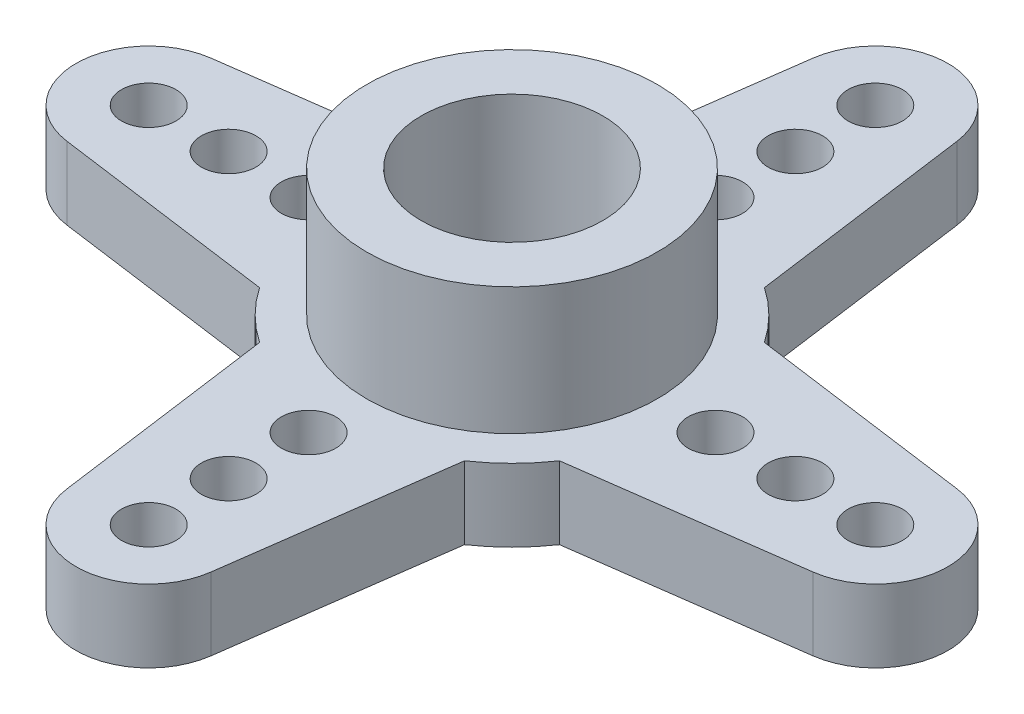
ISO-10303-21;
HEADER;
FILE_DESCRIPTION(('STEP AP214'),'2;1');
FILE_NAME('part.step','',(''),(''),'','','');
FILE_SCHEMA(('AUTOMOTIVE_DESIGN { 1 0 10303 214 1 1 1 1 }'));
ENDSEC;
DATA;
#1=APPLICATION_CONTEXT('core data for automotive mechanical design processes');
#2=APPLICATION_PROTOCOL_DEFINITION('international standard','automotive_design',2000,#1);
#3=PRODUCT_CONTEXT('',#1,'mechanical');
#4=PRODUCT('Part','Part','',(#3));
#5=PRODUCT_RELATED_PRODUCT_CATEGORY('part','',(#4));
#6=PRODUCT_DEFINITION_FORMATION('','',#4);
#7=PRODUCT_DEFINITION_CONTEXT('part definition',#1,'design');
#8=PRODUCT_DEFINITION('design','',#6,#7);
#9=PRODUCT_DEFINITION_SHAPE('','',#8);
#10=(LENGTH_UNIT() NAMED_UNIT(*) SI_UNIT(.MILLI.,.METRE.));
#11=(NAMED_UNIT(*) PLANE_ANGLE_UNIT() SI_UNIT($,.RADIAN.));
#12=(NAMED_UNIT(*) SI_UNIT($,.STERADIAN.) SOLID_ANGLE_UNIT());
#13=UNCERTAINTY_MEASURE_WITH_UNIT(LENGTH_MEASURE(1.E-05),#10,'distance_accuracy_value','');
#14=(GEOMETRIC_REPRESENTATION_CONTEXT(3) GLOBAL_UNCERTAINTY_ASSIGNED_CONTEXT((#13)) GLOBAL_UNIT_ASSIGNED_CONTEXT((#10,
#11,#12)) REPRESENTATION_CONTEXT('',''));
#15=CARTESIAN_POINT('',(0.,0.,0.));
#16=DIRECTION('',(0.,0.,1.));
#17=DIRECTION('',(1.,0.,0.));
#18=AXIS2_PLACEMENT_3D('',#15,#16,#17);
#19=CARTESIAN_POINT('',(-10.,0.,0.));
#20=DIRECTION('',(0.,1.,0.));
#21=DIRECTION('',(0.,0.,1.));
#22=AXIS2_PLACEMENT_3D('',#19,#20,#21);
#23=PLANE('',#22);
#24=DIRECTION('',(-0.990796233549053,0.,0.135361824695926));
#25=VECTOR('',#24,1.);
#26=CARTESIAN_POINT('',(-10.2707236493919,0.,-1.98159246709811));
#27=LINE('',#26,#25);
#28=CARTESIAN_POINT('',(-4.1283561060853,0.,-2.82075802956373));
#29=VERTEX_POINT('',#28);
#30=CARTESIAN_POINT('',(-10.2707236493919,0.,-1.98159246709811));
#31=VERTEX_POINT('',#30);
#32=EDGE_CURVE('E274',#29,#31,#27,.T.);
#33=ORIENTED_EDGE('',*,*,#32,.F.);
#34=CARTESIAN_POINT('',(0.,0.,0.));
#35=DIRECTION('',(0.,1.,0.));
#36=DIRECTION('',(0.,0.,1.));
#37=AXIS2_PLACEMENT_3D('',#34,#35,#36);
#38=CIRCLE('',#37,5.);
#39=CARTESIAN_POINT('',(-2.82075802956377,0.,-4.12835610608527));
#40=VERTEX_POINT('',#39);
#41=EDGE_CURVE('E316',#40,#29,#38,.T.);
#42=ORIENTED_EDGE('',*,*,#41,.F.);
#43=DIRECTION('',(-0.135361824695916,0.,0.990796233549054));
#44=VECTOR('',#43,1.);
#45=CARTESIAN_POINT('',(-1.98159246709822,0.,-10.2707236493918));
#46=LINE('',#45,#44);
#47=CARTESIAN_POINT('',(-1.98159246709822,0.,-10.2707236493918));
#48=VERTEX_POINT('',#47);
#49=EDGE_CURVE('E353',#48,#40,#46,.T.);
#50=ORIENTED_EDGE('',*,*,#49,.F.);
#51=CARTESIAN_POINT('',(-1.05969147632429E-13,0.,-10.));
#52=DIRECTION('',(0.,1.,0.));
#53=DIRECTION('',(-1.,0.,0.));
#54=AXIS2_PLACEMENT_3D('',#51,#52,#53);
#55=CIRCLE('',#54,2.);
#56=CARTESIAN_POINT('',(1.981592467098,0.,-10.2707236493919));
#57=VERTEX_POINT('',#56);
#58=EDGE_CURVE('E168',#57,#48,#55,.T.);
#59=ORIENTED_EDGE('',*,*,#58,.F.);
#60=DIRECTION('',(-0.135361824695937,0.,-0.990796233549051));
#61=VECTOR('',#60,1.);
#62=CARTESIAN_POINT('',(1.981592467098,0.,-10.2707236493919));
#63=LINE('',#62,#61);
#64=CARTESIAN_POINT('',(2.82075802956368,0.,-4.12835610608533));
#65=VERTEX_POINT('',#64);
#66=EDGE_CURVE('E164',#65,#57,#63,.T.);
#67=ORIENTED_EDGE('',*,*,#66,.F.);
#68=CARTESIAN_POINT('',(0.,0.,0.));
#69=DIRECTION('',(0.,1.,0.));
#70=DIRECTION('',(0.,0.,1.));
#71=AXIS2_PLACEMENT_3D('',#68,#69,#70);
#72=CIRCLE('',#71,5.);
#73=CARTESIAN_POINT('',(4.1283561060853,0.,-2.82075802956373));
#74=VERTEX_POINT('',#73);
#75=EDGE_CURVE('E311',#74,#65,#72,.T.);
#76=ORIENTED_EDGE('',*,*,#75,.F.);
#77=DIRECTION('',(-0.990796233549053,0.,-0.135361824695926));
#78=VECTOR('',#77,1.);
#79=CARTESIAN_POINT('',(10.2707236493919,0.,-1.98159246709811));
#80=LINE('',#79,#78);
#81=CARTESIAN_POINT('',(10.2707236493919,0.,-1.98159246709811));
#82=VERTEX_POINT('',#81);
#83=EDGE_CURVE('E199',#82,#74,#80,.T.);
#84=ORIENTED_EDGE('',*,*,#83,.F.);
#85=CARTESIAN_POINT('',(10.,0.,0.));
#86=DIRECTION('',(0.,1.,0.));
#87=DIRECTION('',(0.,0.,-1.));
#88=AXIS2_PLACEMENT_3D('',#85,#86,#87);
#89=CIRCLE('',#88,2.);
#90=CARTESIAN_POINT('',(10.2707236493919,0.,1.98159246709811));
#91=VERTEX_POINT('',#90);
#92=EDGE_CURVE('E184',#91,#82,#89,.T.);
#93=ORIENTED_EDGE('',*,*,#92,.F.);
#94=DIRECTION('',(0.990796233549053,0.,-0.135361824695926));
#95=VECTOR('',#94,1.);
#96=CARTESIAN_POINT('',(10.2707236493919,0.,1.98159246709811));
#97=LINE('',#96,#95);
#98=CARTESIAN_POINT('',(4.1283561060853,0.,2.82075802956373));
#99=VERTEX_POINT('',#98);
#100=EDGE_CURVE('E191',#99,#91,#97,.T.);
#101=ORIENTED_EDGE('',*,*,#100,.F.);
#102=CARTESIAN_POINT('',(0.,0.,0.));
#103=DIRECTION('',(0.,1.,0.));
#104=DIRECTION('',(0.,0.,1.));
#105=AXIS2_PLACEMENT_3D('',#102,#103,#104);
#106=CIRCLE('',#105,5.);
#107=CARTESIAN_POINT('',(2.82075802956374,0.,4.12835610608529));
#108=VERTEX_POINT('',#107);
#109=EDGE_CURVE('E306',#108,#99,#106,.T.);
#110=ORIENTED_EDGE('',*,*,#109,.F.);
#111=DIRECTION('',(0.135361824695923,0.,-0.990796233549053));
#112=VECTOR('',#111,1.);
#113=CARTESIAN_POINT('',(1.98159246709814,0.,10.2707236493918));
#114=LINE('',#113,#112);
#115=CARTESIAN_POINT('',(1.98159246709814,0.,10.2707236493918));
#116=VERTEX_POINT('',#115);
#117=EDGE_CURVE('E235',#116,#108,#114,.T.);
#118=ORIENTED_EDGE('',*,*,#117,.F.);
#119=CARTESIAN_POINT('',(0.,0.,10.));
#120=DIRECTION('',(0.,1.,0.));
#121=DIRECTION('',(1.,0.,0.));
#122=AXIS2_PLACEMENT_3D('',#119,#120,#121);
#123=CIRCLE('',#122,2.);
#124=CARTESIAN_POINT('',(-1.98159246709807,0.,10.2707236493919));
#125=VERTEX_POINT('',#124);
#126=EDGE_CURVE('E221',#125,#116,#123,.T.);
#127=ORIENTED_EDGE('',*,*,#126,.F.);
#128=DIRECTION('',(0.13536182469593,0.,0.990796233549052));
#129=VECTOR('',#128,1.);
#130=CARTESIAN_POINT('',(-1.98159246709807,0.,10.2707236493919));
#131=LINE('',#130,#129);
#132=CARTESIAN_POINT('',(-2.82075802956371,0.,4.12835610608531));
#133=VERTEX_POINT('',#132);
#134=EDGE_CURVE('E228',#133,#125,#131,.T.);
#135=ORIENTED_EDGE('',*,*,#134,.F.);
#136=CARTESIAN_POINT('',(0.,0.,0.));
#137=DIRECTION('',(0.,1.,0.));
#138=DIRECTION('',(0.,0.,1.));
#139=AXIS2_PLACEMENT_3D('',#136,#137,#138);
#140=CIRCLE('',#139,5.);
#141=CARTESIAN_POINT('',(-4.1283561060853,0.,2.82075802956373));
#142=VERTEX_POINT('',#141);
#143=EDGE_CURVE('E300',#142,#133,#140,.T.);
#144=ORIENTED_EDGE('',*,*,#143,.F.);
#145=DIRECTION('',(0.990796233549053,0.,0.135361824695926));
#146=VECTOR('',#145,1.);
#147=CARTESIAN_POINT('',(-10.2707236493919,0.,1.98159246709811));
#148=LINE('',#147,#146);
#149=CARTESIAN_POINT('',(-10.2707236493919,0.,1.98159246709811));
#150=VERTEX_POINT('',#149);
#151=EDGE_CURVE('E298',#150,#142,#148,.T.);
#152=ORIENTED_EDGE('',*,*,#151,.F.);
#153=CARTESIAN_POINT('',(-10.,0.,0.));
#154=DIRECTION('',(0.,1.,0.));
#155=DIRECTION('',(0.,0.,1.));
#156=AXIS2_PLACEMENT_3D('',#153,#154,#155);
#157=CIRCLE('',#156,2.);
#158=EDGE_CURVE('E269',#31,#150,#157,.T.);
#159=ORIENTED_EDGE('',*,*,#158,.F.);
#160=EDGE_LOOP('',(#33,#42,#50,#59,#67,#76,#84,#93,#101,#110,#118,#127,#135,#144,#152,#159));
#161=FACE_BOUND('',#160,.T.);
#162=CARTESIAN_POINT('',(0.,0.,5.6));
#163=DIRECTION('',(0.,-1.,0.));
#164=DIRECTION('',(0.,0.,1.));
#165=AXIS2_PLACEMENT_3D('',#162,#163,#164);
#166=CIRCLE('',#165,0.75);
#167=CARTESIAN_POINT('',(0.,0.,6.35));
#168=VERTEX_POINT('',#167);
#169=EDGE_CURVE('E303',#168,#168,#166,.T.);
#170=ORIENTED_EDGE('',*,*,#169,.F.);
#171=EDGE_LOOP('',(#170));
#172=FACE_BOUND('',#171,.T.);
#173=CARTESIAN_POINT('',(5.6,0.,0.));
#174=DIRECTION('',(0.,-1.,0.));
#175=DIRECTION('',(0.,0.,1.));
#176=AXIS2_PLACEMENT_3D('',#173,#174,#175);
#177=CIRCLE('',#176,0.75);
#178=CARTESIAN_POINT('',(5.6,0.,0.75));
#179=VERTEX_POINT('',#178);
#180=EDGE_CURVE('E308',#179,#179,#177,.T.);
#181=ORIENTED_EDGE('',*,*,#180,.F.);
#182=EDGE_LOOP('',(#181));
#183=FACE_BOUND('',#182,.T.);
#184=CARTESIAN_POINT('',(0.,0.,-5.6));
#185=DIRECTION('',(0.,-1.,0.));
#186=DIRECTION('',(0.,0.,1.));
#187=AXIS2_PLACEMENT_3D('',#184,#185,#186);
#188=CIRCLE('',#187,0.75);
#189=CARTESIAN_POINT('',(0.,0.,-4.85));
#190=VERTEX_POINT('',#189);
#191=EDGE_CURVE('E313',#190,#190,#188,.T.);
#192=ORIENTED_EDGE('',*,*,#191,.F.);
#193=EDGE_LOOP('',(#192));
#194=FACE_BOUND('',#193,.T.);
#195=CARTESIAN_POINT('',(-5.6,0.,0.));
#196=DIRECTION('',(0.,1.,0.));
#197=DIRECTION('',(0.,0.,1.));
#198=AXIS2_PLACEMENT_3D('',#195,#196,#197);
#199=CIRCLE('',#198,0.749999999999999);
#200=CARTESIAN_POINT('',(-5.6,0.,0.75));
#201=VERTEX_POINT('',#200);
#202=EDGE_CURVE('E258',#201,#201,#199,.T.);
#203=ORIENTED_EDGE('',*,*,#202,.T.);
#204=EDGE_LOOP('',(#203));
#205=FACE_BOUND('',#204,.T.);
#206=CARTESIAN_POINT('',(-1.05969147632429E-13,0.,-10.));
#207=DIRECTION('',(0.,1.,0.));
#208=DIRECTION('',(-1.,0.,0.));
#209=AXIS2_PLACEMENT_3D('',#206,#207,#208);
#210=CIRCLE('',#209,0.75);
#211=CARTESIAN_POINT('',(-0.750000000000106,0.,-9.99999999999999));
#212=VERTEX_POINT('',#211);
#213=EDGE_CURVE('E443',#212,#212,#210,.T.);
#214=ORIENTED_EDGE('',*,*,#213,.T.);
#215=EDGE_LOOP('',(#214));
#216=FACE_BOUND('',#215,.T.);
#217=CARTESIAN_POINT('',(0.,0.,-7.8));
#218=DIRECTION('',(0.,1.,0.));
#219=DIRECTION('',(-1.,0.,0.));
#220=AXIS2_PLACEMENT_3D('',#217,#218,#219);
#221=CIRCLE('',#220,0.75);
#222=CARTESIAN_POINT('',(-0.750000000000083,0.,-7.79999999999999));
#223=VERTEX_POINT('',#222);
#224=EDGE_CURVE('E449',#223,#223,#221,.T.);
#225=ORIENTED_EDGE('',*,*,#224,.T.);
#226=EDGE_LOOP('',(#225));
#227=FACE_BOUND('',#226,.T.);
#228=CARTESIAN_POINT('',(10.,0.,0.));
#229=DIRECTION('',(0.,1.,0.));
#230=DIRECTION('',(0.,0.,-1.));
#231=AXIS2_PLACEMENT_3D('',#228,#229,#230);
#232=CIRCLE('',#231,0.75);
#233=CARTESIAN_POINT('',(10.,0.,-0.750000000000002));
#234=VERTEX_POINT('',#233);
#235=EDGE_CURVE('E169',#234,#234,#232,.T.);
#236=ORIENTED_EDGE('',*,*,#235,.T.);
#237=EDGE_LOOP('',(#236));
#238=FACE_BOUND('',#237,.T.);
#239=CARTESIAN_POINT('',(7.8,0.,0.));
#240=DIRECTION('',(0.,1.,0.));
#241=DIRECTION('',(0.,0.,-1.));
#242=AXIS2_PLACEMENT_3D('',#239,#240,#241);
#243=CIRCLE('',#242,0.75);
#244=CARTESIAN_POINT('',(7.8,0.,-0.750000000000001));
#245=VERTEX_POINT('',#244);
#246=EDGE_CURVE('E179',#245,#245,#243,.T.);
#247=ORIENTED_EDGE('',*,*,#246,.T.);
#248=EDGE_LOOP('',(#247));
#249=FACE_BOUND('',#248,.T.);
#250=CARTESIAN_POINT('',(0.,0.,7.8));
#251=DIRECTION('',(0.,1.,0.));
#252=DIRECTION('',(1.,0.,0.));
#253=AXIS2_PLACEMENT_3D('',#250,#251,#252);
#254=CIRCLE('',#253,0.75);
#255=CARTESIAN_POINT('',(0.750000000000029,0.,7.8));
#256=VERTEX_POINT('',#255);
#257=EDGE_CURVE('E215',#256,#256,#254,.T.);
#258=ORIENTED_EDGE('',*,*,#257,.T.);
#259=EDGE_LOOP('',(#258));
#260=FACE_BOUND('',#259,.T.);
#261=CARTESIAN_POINT('',(0.,0.,10.));
#262=DIRECTION('',(0.,1.,0.));
#263=DIRECTION('',(1.,0.,0.));
#264=AXIS2_PLACEMENT_3D('',#261,#262,#263);
#265=CIRCLE('',#264,0.75);
#266=CARTESIAN_POINT('',(0.750000000000036,0.,10.));
#267=VERTEX_POINT('',#266);
#268=EDGE_CURVE('E211',#267,#267,#265,.T.);
#269=ORIENTED_EDGE('',*,*,#268,.T.);
#270=EDGE_LOOP('',(#269));
#271=FACE_BOUND('',#270,.T.);
#272=CARTESIAN_POINT('',(-10.,0.,0.));
#273=DIRECTION('',(0.,1.,0.));
#274=DIRECTION('',(0.,0.,1.));
#275=AXIS2_PLACEMENT_3D('',#272,#273,#274);
#276=CIRCLE('',#275,0.75);
#277=CARTESIAN_POINT('',(-10.,0.,0.750000000000002));
#278=VERTEX_POINT('',#277);
#279=EDGE_CURVE('E248',#278,#278,#276,.T.);
#280=ORIENTED_EDGE('',*,*,#279,.T.);
#281=EDGE_LOOP('',(#280));
#282=FACE_BOUND('',#281,.T.);
#283=CARTESIAN_POINT('',(-7.8,0.,0.));
#284=DIRECTION('',(0.,1.,0.));
#285=DIRECTION('',(0.,0.,1.));
#286=AXIS2_PLACEMENT_3D('',#283,#284,#285);
#287=CIRCLE('',#286,0.75);
#288=CARTESIAN_POINT('',(-7.8,0.,0.750000000000001));
#289=VERTEX_POINT('',#288);
#290=EDGE_CURVE('E252',#289,#289,#287,.T.);
#291=ORIENTED_EDGE('',*,*,#290,.T.);
#292=EDGE_LOOP('',(#291));
#293=FACE_BOUND('',#292,.T.);
#294=CARTESIAN_POINT('',(0.,0.,0.));
#295=DIRECTION('',(0.,1.,0.));
#296=DIRECTION('',(0.,0.,1.));
#297=AXIS2_PLACEMENT_3D('',#294,#295,#296);
#298=CIRCLE('',#297,3.);
#299=CARTESIAN_POINT('',(0.,0.,3.));
#300=VERTEX_POINT('',#299);
#301=EDGE_CURVE('E11',#300,#300,#298,.F.);
#302=ORIENTED_EDGE('',*,*,#301,.F.);
#303=EDGE_LOOP('',(#302));
#304=FACE_BOUND('',#303,.T.);
#305=ADVANCED_FACE('F32',(#161,#172,#183,#194,#205,#216,#227,#238,#249,#260,#271,#282,#293,
#304),#23,.F.);
#306=CARTESIAN_POINT('',(0.,2.,0.));
#307=DIRECTION('',(0.,-1.,0.));
#308=DIRECTION('',(0.,0.,-1.));
#309=AXIS2_PLACEMENT_3D('',#306,#307,#308);
#310=CYLINDRICAL_SURFACE('',#309,0.75);
#311=CARTESIAN_POINT('',(0.,0.,0.));
#312=DIRECTION('',(0.,1.,0.));
#313=DIRECTION('',(0.,0.,1.));
#314=AXIS2_PLACEMENT_3D('',#311,#312,#313);
#315=CIRCLE('',#314,0.75);
#316=CARTESIAN_POINT('',(0.,0.,0.75));
#317=VERTEX_POINT('',#316);
#318=EDGE_CURVE('E264',#317,#317,#315,.T.);
#319=ORIENTED_EDGE('',*,*,#318,.F.);
#320=EDGE_LOOP('',(#319));
#321=FACE_BOUND('',#320,.T.);
#322=CARTESIAN_POINT('',(0.,1.,0.));
#323=DIRECTION('',(0.,1.,0.));
#324=DIRECTION('',(0.,0.,1.));
#325=AXIS2_PLACEMENT_3D('',#322,#323,#324);
#326=CIRCLE('',#325,0.75);
#327=CARTESIAN_POINT('',(0.,1.,0.75));
#328=VERTEX_POINT('',#327);
#329=EDGE_CURVE('E424',#328,#328,#326,.T.);
#330=ORIENTED_EDGE('',*,*,#329,.T.);
#331=EDGE_LOOP('',(#330));
#332=FACE_BOUND('',#331,.T.);
#333=ADVANCED_FACE('F399',(#321,#332),#310,.F.);
#334=CARTESIAN_POINT('',(-10.,2.,0.));
#335=DIRECTION('',(0.,1.,0.));
#336=DIRECTION('',(0.,0.,1.));
#337=AXIS2_PLACEMENT_3D('',#334,#335,#336);
#338=PLANE('',#337);
#339=CARTESIAN_POINT('',(0.,2.,0.));
#340=DIRECTION('',(0.,1.,0.));
#341=DIRECTION('',(0.,0.,1.));
#342=AXIS2_PLACEMENT_3D('',#339,#340,#341);
#343=CIRCLE('',#342,5.);
#344=CARTESIAN_POINT('',(-2.82075802956377,2.,-4.12835610608527));
#345=VERTEX_POINT('',#344);
#346=CARTESIAN_POINT('',(-4.1283561060853,2.,-2.82075802956373));
#347=VERTEX_POINT('',#346);
#348=EDGE_CURVE('E291',#345,#347,#343,.T.);
#349=ORIENTED_EDGE('',*,*,#348,.T.);
#350=DIRECTION('',(-0.990796233549053,0.,0.135361824695926));
#351=VECTOR('',#350,1.);
#352=CARTESIAN_POINT('',(-10.2707236493919,2.,-1.98159246709811));
#353=LINE('',#352,#351);
#354=CARTESIAN_POINT('',(-10.2707236493919,2.,-1.98159246709811));
#355=VERTEX_POINT('',#354);
#356=EDGE_CURVE('E293',#347,#355,#353,.T.);
#357=ORIENTED_EDGE('',*,*,#356,.T.);
#358=CARTESIAN_POINT('',(-10.,2.,0.));
#359=DIRECTION('',(0.,1.,0.));
#360=DIRECTION('',(0.,0.,1.));
#361=AXIS2_PLACEMENT_3D('',#358,#359,#360);
#362=CIRCLE('',#361,2.);
#363=CARTESIAN_POINT('',(-10.2707236493919,2.,1.98159246709811));
#364=VERTEX_POINT('',#363);
#365=EDGE_CURVE('E270',#355,#364,#362,.T.);
#366=ORIENTED_EDGE('',*,*,#365,.T.);
#367=DIRECTION('',(0.990796233549053,0.,0.135361824695926));
#368=VECTOR('',#367,1.);
#369=CARTESIAN_POINT('',(-10.2707236493919,2.,1.98159246709811));
#370=LINE('',#369,#368);
#371=CARTESIAN_POINT('',(-4.1283561060853,2.,2.82075802956373));
#372=VERTEX_POINT('',#371);
#373=EDGE_CURVE('E273',#364,#372,#370,.T.);
#374=ORIENTED_EDGE('',*,*,#373,.T.);
#375=CARTESIAN_POINT('',(0.,2.,0.));
#376=DIRECTION('',(0.,1.,0.));
#377=DIRECTION('',(0.,0.,1.));
#378=AXIS2_PLACEMENT_3D('',#375,#376,#377);
#379=CIRCLE('',#378,5.);
#380=CARTESIAN_POINT('',(-2.82075802956371,2.,4.12835610608531));
#381=VERTEX_POINT('',#380);
#382=EDGE_CURVE('E276',#372,#381,#379,.T.);
#383=ORIENTED_EDGE('',*,*,#382,.T.);
#384=DIRECTION('',(0.13536182469593,0.,0.990796233549052));
#385=VECTOR('',#384,1.);
#386=CARTESIAN_POINT('',(-1.98159246709807,2.,10.2707236493919));
#387=LINE('',#386,#385);
#388=CARTESIAN_POINT('',(-1.98159246709807,2.,10.2707236493919));
#389=VERTEX_POINT('',#388);
#390=EDGE_CURVE('E230',#381,#389,#387,.T.);
#391=ORIENTED_EDGE('',*,*,#390,.T.);
#392=CARTESIAN_POINT('',(0.,2.,10.));
#393=DIRECTION('',(0.,1.,0.));
#394=DIRECTION('',(1.,0.,0.));
#395=AXIS2_PLACEMENT_3D('',#392,#393,#394);
#396=CIRCLE('',#395,2.);
#397=CARTESIAN_POINT('',(1.98159246709814,2.,10.2707236493918));
#398=VERTEX_POINT('',#397);
#399=EDGE_CURVE('E224',#389,#398,#396,.T.);
#400=ORIENTED_EDGE('',*,*,#399,.T.);
#401=DIRECTION('',(0.135361824695923,0.,-0.990796233549053));
#402=VECTOR('',#401,1.);
#403=CARTESIAN_POINT('',(1.98159246709814,2.,10.2707236493918));
#404=LINE('',#403,#402);
#405=CARTESIAN_POINT('',(2.82075802956374,2.,4.12835610608529));
#406=VERTEX_POINT('',#405);
#407=EDGE_CURVE('E227',#398,#406,#404,.T.);
#408=ORIENTED_EDGE('',*,*,#407,.T.);
#409=CARTESIAN_POINT('',(0.,2.,0.));
#410=DIRECTION('',(0.,1.,0.));
#411=DIRECTION('',(0.,0.,1.));
#412=AXIS2_PLACEMENT_3D('',#409,#410,#411);
#413=CIRCLE('',#412,5.);
#414=CARTESIAN_POINT('',(4.1283561060853,2.,2.82075802956373));
#415=VERTEX_POINT('',#414);
#416=EDGE_CURVE('E51',#406,#415,#413,.T.);
#417=ORIENTED_EDGE('',*,*,#416,.T.);
#418=DIRECTION('',(0.990796233549053,0.,-0.135361824695926));
#419=VECTOR('',#418,1.);
#420=CARTESIAN_POINT('',(10.2707236493919,2.,1.98159246709811));
#421=LINE('',#420,#419);
#422=CARTESIAN_POINT('',(10.2707236493919,2.,1.98159246709811));
#423=VERTEX_POINT('',#422);
#424=EDGE_CURVE('E194',#415,#423,#421,.T.);
#425=ORIENTED_EDGE('',*,*,#424,.T.);
#426=CARTESIAN_POINT('',(10.,2.,0.));
#427=DIRECTION('',(0.,1.,0.));
#428=DIRECTION('',(0.,0.,-1.));
#429=AXIS2_PLACEMENT_3D('',#426,#427,#428);
#430=CIRCLE('',#429,2.);
#431=CARTESIAN_POINT('',(10.2707236493919,2.,-1.98159246709811));
#432=VERTEX_POINT('',#431);
#433=EDGE_CURVE('E187',#423,#432,#430,.T.);
#434=ORIENTED_EDGE('',*,*,#433,.T.);
#435=DIRECTION('',(-0.990796233549053,0.,-0.135361824695926));
#436=VECTOR('',#435,1.);
#437=CARTESIAN_POINT('',(10.2707236493919,2.,-1.98159246709811));
#438=LINE('',#437,#436);
#439=CARTESIAN_POINT('',(4.1283561060853,2.,-2.82075802956373));
#440=VERTEX_POINT('',#439);
#441=EDGE_CURVE('E190',#432,#440,#438,.T.);
#442=ORIENTED_EDGE('',*,*,#441,.T.);
#443=CARTESIAN_POINT('',(0.,2.,0.));
#444=DIRECTION('',(0.,1.,0.));
#445=DIRECTION('',(0.,0.,1.));
#446=AXIS2_PLACEMENT_3D('',#443,#444,#445);
#447=CIRCLE('',#446,5.);
#448=CARTESIAN_POINT('',(2.82075802956369,2.,-4.12835610608533));
#449=VERTEX_POINT('',#448);
#450=EDGE_CURVE('E286',#440,#449,#447,.T.);
#451=ORIENTED_EDGE('',*,*,#450,.T.);
#452=DIRECTION('',(-0.135361824695937,0.,-0.990796233549051));
#453=VECTOR('',#452,1.);
#454=CARTESIAN_POINT('',(1.981592467098,2.,-10.2707236493919));
#455=LINE('',#454,#453);
#456=CARTESIAN_POINT('',(1.981592467098,2.,-10.2707236493919));
#457=VERTEX_POINT('',#456);
#458=EDGE_CURVE('E153',#449,#457,#455,.T.);
#459=ORIENTED_EDGE('',*,*,#458,.T.);
#460=CARTESIAN_POINT('',(-1.05969147632429E-13,2.,-10.));
#461=DIRECTION('',(0.,1.,0.));
#462=DIRECTION('',(-1.,0.,0.));
#463=AXIS2_PLACEMENT_3D('',#460,#461,#462);
#464=CIRCLE('',#463,2.);
#465=CARTESIAN_POINT('',(-1.98159246709822,2.,-10.2707236493918));
#466=VERTEX_POINT('',#465);
#467=EDGE_CURVE('E154',#457,#466,#464,.T.);
#468=ORIENTED_EDGE('',*,*,#467,.T.);
#469=DIRECTION('',(-0.135361824695916,0.,0.990796233549054));
#470=VECTOR('',#469,1.);
#471=CARTESIAN_POINT('',(-1.98159246709822,2.,-10.2707236493918));
#472=LINE('',#471,#470);
#473=EDGE_CURVE('E144',#466,#345,#472,.T.);
#474=ORIENTED_EDGE('',*,*,#473,.T.);
#475=EDGE_LOOP('',(#349,#357,#366,#374,#383,#391,#400,#408,#417,#425,#434,#442,#451,#459,#468,#474));
#476=FACE_BOUND('',#475,.T.);
#477=CARTESIAN_POINT('',(0.,2.,5.6));
#478=DIRECTION('',(0.,-1.,0.));
#479=DIRECTION('',(0.,0.,1.));
#480=AXIS2_PLACEMENT_3D('',#477,#478,#479);
#481=CIRCLE('',#480,0.75);
#482=CARTESIAN_POINT('',(0.,2.,6.35));
#483=VERTEX_POINT('',#482);
#484=EDGE_CURVE('E279',#483,#483,#481,.T.);
#485=ORIENTED_EDGE('',*,*,#484,.T.);
#486=EDGE_LOOP('',(#485));
#487=FACE_BOUND('',#486,.T.);
#488=CARTESIAN_POINT('',(5.6,2.,0.));
#489=DIRECTION('',(0.,-1.,0.));
#490=DIRECTION('',(0.,0.,1.));
#491=AXIS2_PLACEMENT_3D('',#488,#489,#490);
#492=CIRCLE('',#491,0.75);
#493=CARTESIAN_POINT('',(5.6,2.,0.75));
#494=VERTEX_POINT('',#493);
#495=EDGE_CURVE('E283',#494,#494,#492,.T.);
#496=ORIENTED_EDGE('',*,*,#495,.T.);
#497=EDGE_LOOP('',(#496));
#498=FACE_BOUND('',#497,.T.);
#499=CARTESIAN_POINT('',(0.,2.,-5.6));
#500=DIRECTION('',(0.,-1.,0.));
#501=DIRECTION('',(0.,0.,1.));
#502=AXIS2_PLACEMENT_3D('',#499,#500,#501);
#503=CIRCLE('',#502,0.75);
#504=CARTESIAN_POINT('',(0.,2.,-4.85));
#505=VERTEX_POINT('',#504);
#506=EDGE_CURVE('E288',#505,#505,#503,.T.);
#507=ORIENTED_EDGE('',*,*,#506,.T.);
#508=EDGE_LOOP('',(#507));
#509=FACE_BOUND('',#508,.T.);
#510=CARTESIAN_POINT('',(-5.6,2.,0.));
#511=DIRECTION('',(0.,1.,0.));
#512=DIRECTION('',(0.,0.,1.));
#513=AXIS2_PLACEMENT_3D('',#510,#511,#512);
#514=CIRCLE('',#513,0.749999999999999);
#515=CARTESIAN_POINT('',(-5.6,2.,0.75));
#516=VERTEX_POINT('',#515);
#517=EDGE_CURVE('E261',#516,#516,#514,.T.);
#518=ORIENTED_EDGE('',*,*,#517,.F.);
#519=EDGE_LOOP('',(#518));
#520=FACE_BOUND('',#519,.T.);
#521=CARTESIAN_POINT('',(-1.05969147632429E-13,2.,-10.));
#522=DIRECTION('',(0.,1.,0.));
#523=DIRECTION('',(-1.,0.,0.));
#524=AXIS2_PLACEMENT_3D('',#521,#522,#523);
#525=CIRCLE('',#524,0.75);
#526=CARTESIAN_POINT('',(-0.750000000000106,2.,-9.99999999999999));
#527=VERTEX_POINT('',#526);
#528=EDGE_CURVE('E446',#527,#527,#525,.T.);
#529=ORIENTED_EDGE('',*,*,#528,.F.);
#530=EDGE_LOOP('',(#529));
#531=FACE_BOUND('',#530,.T.);
#532=CARTESIAN_POINT('',(0.,2.,-7.8));
#533=DIRECTION('',(0.,1.,0.));
#534=DIRECTION('',(-1.,0.,0.));
#535=AXIS2_PLACEMENT_3D('',#532,#533,#534);
#536=CIRCLE('',#535,0.75);
#537=CARTESIAN_POINT('',(-0.750000000000083,2.,-7.79999999999999));
#538=VERTEX_POINT('',#537);
#539=EDGE_CURVE('E356',#538,#538,#536,.T.);
#540=ORIENTED_EDGE('',*,*,#539,.F.);
#541=EDGE_LOOP('',(#540));
#542=FACE_BOUND('',#541,.T.);
#543=CARTESIAN_POINT('',(10.,2.,0.));
#544=DIRECTION('',(0.,1.,0.));
#545=DIRECTION('',(0.,0.,-1.));
#546=AXIS2_PLACEMENT_3D('',#543,#544,#545);
#547=CIRCLE('',#546,0.75);
#548=CARTESIAN_POINT('',(10.,2.,-0.750000000000002));
#549=VERTEX_POINT('',#548);
#550=EDGE_CURVE('E172',#549,#549,#547,.T.);
#551=ORIENTED_EDGE('',*,*,#550,.F.);
#552=EDGE_LOOP('',(#551));
#553=FACE_BOUND('',#552,.T.);
#554=CARTESIAN_POINT('',(7.8,2.,0.));
#555=DIRECTION('',(0.,1.,0.));
#556=DIRECTION('',(0.,0.,-1.));
#557=AXIS2_PLACEMENT_3D('',#554,#555,#556);
#558=CIRCLE('',#557,0.75);
#559=CARTESIAN_POINT('',(7.8,2.,-0.750000000000001));
#560=VERTEX_POINT('',#559);
#561=EDGE_CURVE('E181',#560,#560,#558,.T.);
#562=ORIENTED_EDGE('',*,*,#561,.F.);
#563=EDGE_LOOP('',(#562));
#564=FACE_BOUND('',#563,.T.);
#565=CARTESIAN_POINT('',(0.,2.,7.8));
#566=DIRECTION('',(0.,1.,0.));
#567=DIRECTION('',(1.,0.,0.));
#568=AXIS2_PLACEMENT_3D('',#565,#566,#567);
#569=CIRCLE('',#568,0.75);
#570=CARTESIAN_POINT('',(0.750000000000029,2.,7.8));
#571=VERTEX_POINT('',#570);
#572=EDGE_CURVE('E218',#571,#571,#569,.T.);
#573=ORIENTED_EDGE('',*,*,#572,.F.);
#574=EDGE_LOOP('',(#573));
#575=FACE_BOUND('',#574,.T.);
#576=CARTESIAN_POINT('',(0.,2.,10.));
#577=DIRECTION('',(0.,1.,0.));
#578=DIRECTION('',(1.,0.,0.));
#579=AXIS2_PLACEMENT_3D('',#576,#577,#578);
#580=CIRCLE('',#579,0.75);
#581=CARTESIAN_POINT('',(0.750000000000036,2.,10.));
#582=VERTEX_POINT('',#581);
#583=EDGE_CURVE('E212',#582,#582,#580,.T.);
#584=ORIENTED_EDGE('',*,*,#583,.F.);
#585=EDGE_LOOP('',(#584));
#586=FACE_BOUND('',#585,.T.);
#587=CARTESIAN_POINT('',(-10.,2.,0.));
#588=DIRECTION('',(0.,1.,0.));
#589=DIRECTION('',(0.,0.,1.));
#590=AXIS2_PLACEMENT_3D('',#587,#588,#589);
#591=CIRCLE('',#590,0.75);
#592=CARTESIAN_POINT('',(-10.,2.,0.750000000000002));
#593=VERTEX_POINT('',#592);
#594=EDGE_CURVE('E249',#593,#593,#591,.T.);
#595=ORIENTED_EDGE('',*,*,#594,.F.);
#596=EDGE_LOOP('',(#595));
#597=FACE_BOUND('',#596,.T.);
#598=CARTESIAN_POINT('',(-7.8,2.,0.));
#599=DIRECTION('',(0.,1.,0.));
#600=DIRECTION('',(0.,0.,1.));
#601=AXIS2_PLACEMENT_3D('',#598,#599,#600);
#602=CIRCLE('',#601,0.75);
#603=CARTESIAN_POINT('',(-7.8,2.,0.750000000000001));
#604=VERTEX_POINT('',#603);
#605=EDGE_CURVE('E255',#604,#604,#602,.T.);
#606=ORIENTED_EDGE('',*,*,#605,.F.);
#607=EDGE_LOOP('',(#606));
#608=FACE_BOUND('',#607,.T.);
#609=CARTESIAN_POINT('',(0.,2.,0.));
#610=DIRECTION('',(0.,1.,0.));
#611=DIRECTION('',(0.,0.,1.));
#612=AXIS2_PLACEMENT_3D('',#609,#610,#611);
#613=CIRCLE('',#612,4.);
#614=CARTESIAN_POINT('',(0.,2.,4.));
#615=VERTEX_POINT('',#614);
#616=EDGE_CURVE('E439',#615,#615,#613,.T.);
#617=ORIENTED_EDGE('',*,*,#616,.F.);
#618=EDGE_LOOP('',(#617));
#619=FACE_BOUND('',#618,.T.);
#620=ADVANCED_FACE('F157',(#476,#487,#498,#509,#520,#531,#542,#553,#564,#575,#586,#597,#608,
#619),#338,.T.);
#621=CARTESIAN_POINT('',(0.,2.,0.));
#622=DIRECTION('',(0.,-1.,0.));
#623=DIRECTION('',(0.,0.,-1.));
#624=AXIS2_PLACEMENT_3D('',#621,#622,#623);
#625=CYLINDRICAL_SURFACE('',#624,5.);
#626=DIRECTION('',(0.,-1.,0.));
#627=VECTOR('',#626,1.);
#628=CARTESIAN_POINT('',(-2.82075802956371,2.,4.12835610608531));
#629=LINE('',#628,#627);
#630=EDGE_CURVE('E241',#381,#133,#629,.T.);
#631=ORIENTED_EDGE('',*,*,#630,.F.);
#632=ORIENTED_EDGE('',*,*,#382,.F.);
#633=DIRECTION('',(0.,-1.,0.));
#634=VECTOR('',#633,1.);
#635=CARTESIAN_POINT('',(-4.1283561060853,2.,2.82075802956373));
#636=LINE('',#635,#634);
#637=EDGE_CURVE('E324',#372,#142,#636,.T.);
#638=ORIENTED_EDGE('',*,*,#637,.T.);
#639=ORIENTED_EDGE('',*,*,#143,.T.);
#640=EDGE_LOOP('',(#631,#632,#638,#639));
#641=FACE_BOUND('',#640,.T.);
#642=ADVANCED_FACE('F344',(#641),#625,.T.);
#643=CARTESIAN_POINT('',(0.,2.,0.));
#644=DIRECTION('',(0.,-1.,0.));
#645=DIRECTION('',(0.,0.,-1.));
#646=AXIS2_PLACEMENT_3D('',#643,#644,#645);
#647=CYLINDRICAL_SURFACE('',#646,5.);
#648=DIRECTION('',(0.,-1.,0.));
#649=VECTOR('',#648,1.);
#650=CARTESIAN_POINT('',(2.82075802956374,2.,4.12835610608529));
#651=LINE('',#650,#649);
#652=EDGE_CURVE('E243',#406,#108,#651,.T.);
#653=ORIENTED_EDGE('',*,*,#652,.T.);
#654=ORIENTED_EDGE('',*,*,#109,.T.);
#655=DIRECTION('',(0.,-1.,0.));
#656=VECTOR('',#655,1.);
#657=CARTESIAN_POINT('',(4.1283561060853,2.,2.82075802956373));
#658=LINE('',#657,#656);
#659=EDGE_CURVE('E47',#415,#99,#658,.T.);
#660=ORIENTED_EDGE('',*,*,#659,.F.);
#661=ORIENTED_EDGE('',*,*,#416,.F.);
#662=EDGE_LOOP('',(#653,#654,#660,#661));
#663=FACE_BOUND('',#662,.T.);
#664=ADVANCED_FACE('F386',(#663),#647,.T.);
#665=CARTESIAN_POINT('',(0.,2.,0.));
#666=DIRECTION('',(0.,-1.,0.));
#667=DIRECTION('',(0.,0.,-1.));
#668=AXIS2_PLACEMENT_3D('',#665,#666,#667);
#669=CYLINDRICAL_SURFACE('',#668,5.);
#670=DIRECTION('',(0.,-1.,0.));
#671=VECTOR('',#670,1.);
#672=CARTESIAN_POINT('',(2.82075802956368,2.,-4.12835610608533));
#673=LINE('',#672,#671);
#674=EDGE_CURVE('E174',#449,#65,#673,.T.);
#675=ORIENTED_EDGE('',*,*,#674,.F.);
#676=ORIENTED_EDGE('',*,*,#450,.F.);
#677=DIRECTION('',(0.,-1.,0.));
#678=VECTOR('',#677,1.);
#679=CARTESIAN_POINT('',(4.1283561060853,2.,-2.82075802956373));
#680=LINE('',#679,#678);
#681=EDGE_CURVE('E206',#440,#74,#680,.T.);
#682=ORIENTED_EDGE('',*,*,#681,.T.);
#683=ORIENTED_EDGE('',*,*,#75,.T.);
#684=EDGE_LOOP('',(#675,#676,#682,#683));
#685=FACE_BOUND('',#684,.T.);
#686=ADVANCED_FACE('F388',(#685),#669,.T.);
#687=CARTESIAN_POINT('',(0.,2.,0.));
#688=DIRECTION('',(0.,-1.,0.));
#689=DIRECTION('',(0.,0.,-1.));
#690=AXIS2_PLACEMENT_3D('',#687,#688,#689);
#691=CYLINDRICAL_SURFACE('',#690,5.);
#692=DIRECTION('',(0.,-1.,0.));
#693=VECTOR('',#692,1.);
#694=CARTESIAN_POINT('',(-2.82075802956377,2.,-4.12835610608527));
#695=LINE('',#694,#693);
#696=EDGE_CURVE('E151',#345,#40,#695,.T.);
#697=ORIENTED_EDGE('',*,*,#696,.T.);
#698=ORIENTED_EDGE('',*,*,#41,.T.);
#699=DIRECTION('',(0.,-1.,0.));
#700=VECTOR('',#699,1.);
#701=CARTESIAN_POINT('',(-4.1283561060853,2.,-2.82075802956373));
#702=LINE('',#701,#700);
#703=EDGE_CURVE('E321',#347,#29,#702,.T.);
#704=ORIENTED_EDGE('',*,*,#703,.F.);
#705=ORIENTED_EDGE('',*,*,#348,.F.);
#706=EDGE_LOOP('',(#697,#698,#704,#705));
#707=FACE_BOUND('',#706,.T.);
#708=ADVANCED_FACE('F352',(#707),#691,.T.);
#709=CARTESIAN_POINT('',(0.,0.,0.));
#710=DIRECTION('',(0.,-1.,0.));
#711=DIRECTION('',(0.,0.,-1.));
#712=AXIS2_PLACEMENT_3D('',#709,#710,#711);
#713=CIRCLE('',#712,2.5);
#714=CARTESIAN_POINT('',(0.,0.,-2.5));
#715=VERTEX_POINT('',#714);
#716=EDGE_CURVE('E419',#715,#715,#713,.T.);
#717=ORIENTED_EDGE('',*,*,#716,.T.);
#718=EDGE_LOOP('',(#717));
#719=FACE_BOUND('',#718,.T.);
#720=ORIENTED_EDGE('',*,*,#318,.T.);
#721=EDGE_LOOP('',(#720));
#722=FACE_BOUND('',#721,.T.);
#723=ADVANCED_FACE('F401',(#719,#722),#23,.F.);
#724=CARTESIAN_POINT('',(-10.,2.,0.));
#725=DIRECTION('',(0.,-1.,0.));
#726=DIRECTION('',(0.,0.,-1.));
#727=AXIS2_PLACEMENT_3D('',#724,#725,#726);
#728=CYLINDRICAL_SURFACE('',#727,2.);
#729=ORIENTED_EDGE('',*,*,#158,.T.);
#730=DIRECTION('',(0.,-1.,0.));
#731=VECTOR('',#730,1.);
#732=CARTESIAN_POINT('',(-10.2707236493919,2.,1.98159246709811));
#733=LINE('',#732,#731);
#734=EDGE_CURVE('E40',#364,#150,#733,.T.);
#735=ORIENTED_EDGE('',*,*,#734,.F.);
#736=ORIENTED_EDGE('',*,*,#365,.F.);
#737=DIRECTION('',(0.,-1.,0.));
#738=VECTOR('',#737,1.);
#739=CARTESIAN_POINT('',(-10.2707236493919,2.,-1.98159246709811));
#740=LINE('',#739,#738);
#741=EDGE_CURVE('E295',#355,#31,#740,.T.);
#742=ORIENTED_EDGE('',*,*,#741,.T.);
#743=EDGE_LOOP('',(#729,#735,#736,#742));
#744=FACE_BOUND('',#743,.T.);
#745=ADVANCED_FACE('F34',(#744),#728,.T.);
#746=CARTESIAN_POINT('',(-10.2707236493919,2.,1.98159246709811));
#747=DIRECTION('',(0.135361824695926,0.,-0.990796233549053));
#748=DIRECTION('',(-0.990796233549053,0.,-0.135361824695926));
#749=AXIS2_PLACEMENT_3D('',#746,#747,#748);
#750=PLANE('',#749);
#751=ORIENTED_EDGE('',*,*,#151,.T.);
#752=ORIENTED_EDGE('',*,*,#637,.F.);
#753=ORIENTED_EDGE('',*,*,#373,.F.);
#754=ORIENTED_EDGE('',*,*,#734,.T.);
#755=EDGE_LOOP('',(#751,#752,#753,#754));
#756=FACE_BOUND('',#755,.T.);
#757=ADVANCED_FACE('F329',(#756),#750,.F.);
#758=CARTESIAN_POINT('',(0.,2.,5.6));
#759=DIRECTION('',(0.,-1.,0.));
#760=DIRECTION('',(0.,0.,-1.));
#761=AXIS2_PLACEMENT_3D('',#758,#759,#760);
#762=CYLINDRICAL_SURFACE('',#761,0.75);
#763=ORIENTED_EDGE('',*,*,#169,.T.);
#764=EDGE_LOOP('',(#763));
#765=FACE_BOUND('',#764,.T.);
#766=ORIENTED_EDGE('',*,*,#484,.F.);
#767=EDGE_LOOP('',(#766));
#768=FACE_BOUND('',#767,.T.);
#769=ADVANCED_FACE('F558',(#765,#768),#762,.F.);
#770=CARTESIAN_POINT('',(5.6,2.,0.));
#771=DIRECTION('',(0.,-1.,0.));
#772=DIRECTION('',(0.,0.,-1.));
#773=AXIS2_PLACEMENT_3D('',#770,#771,#772);
#774=CYLINDRICAL_SURFACE('',#773,0.75);
#775=ORIENTED_EDGE('',*,*,#180,.T.);
#776=EDGE_LOOP('',(#775));
#777=FACE_BOUND('',#776,.T.);
#778=ORIENTED_EDGE('',*,*,#495,.F.);
#779=EDGE_LOOP('',(#778));
#780=FACE_BOUND('',#779,.T.);
#781=ADVANCED_FACE('F563',(#777,#780),#774,.F.);
#782=CARTESIAN_POINT('',(0.,2.,-5.6));
#783=DIRECTION('',(0.,-1.,0.));
#784=DIRECTION('',(0.,0.,-1.));
#785=AXIS2_PLACEMENT_3D('',#782,#783,#784);
#786=CYLINDRICAL_SURFACE('',#785,0.75);
#787=ORIENTED_EDGE('',*,*,#191,.T.);
#788=EDGE_LOOP('',(#787));
#789=FACE_BOUND('',#788,.T.);
#790=ORIENTED_EDGE('',*,*,#506,.F.);
#791=EDGE_LOOP('',(#790));
#792=FACE_BOUND('',#791,.T.);
#793=ADVANCED_FACE('F575',(#789,#792),#786,.F.);
#794=CARTESIAN_POINT('',(-10.2707236493919,2.,-1.98159246709811));
#795=DIRECTION('',(0.135361824695926,0.,0.990796233549053));
#796=DIRECTION('',(0.990796233549053,0.,-0.135361824695926));
#797=AXIS2_PLACEMENT_3D('',#794,#795,#796);
#798=PLANE('',#797);
#799=ORIENTED_EDGE('',*,*,#32,.T.);
#800=ORIENTED_EDGE('',*,*,#741,.F.);
#801=ORIENTED_EDGE('',*,*,#356,.F.);
#802=ORIENTED_EDGE('',*,*,#703,.T.);
#803=EDGE_LOOP('',(#799,#800,#801,#802));
#804=FACE_BOUND('',#803,.T.);
#805=ADVANCED_FACE('F350',(#804),#798,.F.);
#806=CARTESIAN_POINT('',(-5.6,2.,0.));
#807=DIRECTION('',(0.,-1.,0.));
#808=DIRECTION('',(0.,0.,-1.));
#809=AXIS2_PLACEMENT_3D('',#806,#807,#808);
#810=CYLINDRICAL_SURFACE('',#809,0.749999999999999);
#811=ORIENTED_EDGE('',*,*,#517,.T.);
#812=EDGE_LOOP('',(#811));
#813=FACE_BOUND('',#812,.T.);
#814=ORIENTED_EDGE('',*,*,#202,.F.);
#815=EDGE_LOOP('',(#814));
#816=FACE_BOUND('',#815,.T.);
#817=ADVANCED_FACE('F517',(#813,#816),#810,.F.);
#818=CARTESIAN_POINT('',(-7.8,2.,0.));
#819=DIRECTION('',(0.,-1.,0.));
#820=DIRECTION('',(0.,0.,-1.));
#821=AXIS2_PLACEMENT_3D('',#818,#819,#820);
#822=CYLINDRICAL_SURFACE('',#821,0.75);
#823=ORIENTED_EDGE('',*,*,#605,.T.);
#824=EDGE_LOOP('',(#823));
#825=FACE_BOUND('',#824,.T.);
#826=ORIENTED_EDGE('',*,*,#290,.F.);
#827=EDGE_LOOP('',(#826));
#828=FACE_BOUND('',#827,.T.);
#829=ADVANCED_FACE('F471',(#825,#828),#822,.F.);
#830=CARTESIAN_POINT('',(-10.,2.,0.));
#831=DIRECTION('',(0.,-1.,0.));
#832=DIRECTION('',(0.,0.,-1.));
#833=AXIS2_PLACEMENT_3D('',#830,#831,#832);
#834=CYLINDRICAL_SURFACE('',#833,0.75);
#835=ORIENTED_EDGE('',*,*,#594,.T.);
#836=EDGE_LOOP('',(#835));
#837=FACE_BOUND('',#836,.T.);
#838=ORIENTED_EDGE('',*,*,#279,.F.);
#839=EDGE_LOOP('',(#838));
#840=FACE_BOUND('',#839,.T.);
#841=ADVANCED_FACE('F462',(#837,#840),#834,.F.);
#842=CARTESIAN_POINT('',(0.,2.,-7.8));
#843=DIRECTION('',(0.,-1.,0.));
#844=DIRECTION('',(0.,0.,-1.));
#845=AXIS2_PLACEMENT_3D('',#842,#843,#844);
#846=CYLINDRICAL_SURFACE('',#845,0.75);
#847=ORIENTED_EDGE('',*,*,#539,.T.);
#848=EDGE_LOOP('',(#847));
#849=FACE_BOUND('',#848,.T.);
#850=ORIENTED_EDGE('',*,*,#224,.F.);
#851=EDGE_LOOP('',(#850));
#852=FACE_BOUND('',#851,.T.);
#853=ADVANCED_FACE('F459',(#849,#852),#846,.F.);
#854=CARTESIAN_POINT('',(-1.05969147632429E-13,2.,-10.));
#855=DIRECTION('',(0.,-1.,0.));
#856=DIRECTION('',(0.,0.,-1.));
#857=AXIS2_PLACEMENT_3D('',#854,#855,#856);
#858=CYLINDRICAL_SURFACE('',#857,0.75);
#859=ORIENTED_EDGE('',*,*,#528,.T.);
#860=EDGE_LOOP('',(#859));
#861=FACE_BOUND('',#860,.T.);
#862=ORIENTED_EDGE('',*,*,#213,.F.);
#863=EDGE_LOOP('',(#862));
#864=FACE_BOUND('',#863,.T.);
#865=ADVANCED_FACE('F461',(#861,#864),#858,.F.);
#866=CARTESIAN_POINT('',(-1.05969147632429E-13,2.,-10.));
#867=DIRECTION('',(0.,-1.,0.));
#868=DIRECTION('',(0.,0.,-1.));
#869=AXIS2_PLACEMENT_3D('',#866,#867,#868);
#870=CYLINDRICAL_SURFACE('',#869,2.);
#871=ORIENTED_EDGE('',*,*,#58,.T.);
#872=DIRECTION('',(0.,-1.,0.));
#873=VECTOR('',#872,1.);
#874=CARTESIAN_POINT('',(-1.98159246709822,2.,-10.2707236493918));
#875=LINE('',#874,#873);
#876=EDGE_CURVE('E149',#466,#48,#875,.T.);
#877=ORIENTED_EDGE('',*,*,#876,.F.);
#878=ORIENTED_EDGE('',*,*,#467,.F.);
#879=DIRECTION('',(0.,-1.,0.));
#880=VECTOR('',#879,1.);
#881=CARTESIAN_POINT('',(1.981592467098,2.,-10.2707236493919));
#882=LINE('',#881,#880);
#883=EDGE_CURVE('E360',#457,#57,#882,.T.);
#884=ORIENTED_EDGE('',*,*,#883,.T.);
#885=EDGE_LOOP('',(#871,#877,#878,#884));
#886=FACE_BOUND('',#885,.T.);
#887=ADVANCED_FACE('F166',(#886),#870,.T.);
#888=CARTESIAN_POINT('',(-1.98159246709822,2.,-10.2707236493918));
#889=DIRECTION('',(0.990796233549054,0.,0.135361824695916));
#890=DIRECTION('',(0.135361824695916,0.,-0.990796233549054));
#891=AXIS2_PLACEMENT_3D('',#888,#889,#890);
#892=PLANE('',#891);
#893=ORIENTED_EDGE('',*,*,#49,.T.);
#894=ORIENTED_EDGE('',*,*,#696,.F.);
#895=ORIENTED_EDGE('',*,*,#473,.F.);
#896=ORIENTED_EDGE('',*,*,#876,.T.);
#897=EDGE_LOOP('',(#893,#894,#895,#896));
#898=FACE_BOUND('',#897,.T.);
#899=ADVANCED_FACE('F147',(#898),#892,.F.);
#900=CARTESIAN_POINT('',(1.981592467098,2.,-10.2707236493919));
#901=DIRECTION('',(-0.990796233549052,0.,0.135361824695937));
#902=DIRECTION('',(0.135361824695937,0.,0.990796233549052));
#903=AXIS2_PLACEMENT_3D('',#900,#901,#902);
#904=PLANE('',#903);
#905=ORIENTED_EDGE('',*,*,#66,.T.);
#906=ORIENTED_EDGE('',*,*,#883,.F.);
#907=ORIENTED_EDGE('',*,*,#458,.F.);
#908=ORIENTED_EDGE('',*,*,#674,.T.);
#909=EDGE_LOOP('',(#905,#906,#907,#908));
#910=FACE_BOUND('',#909,.T.);
#911=ADVANCED_FACE('F364',(#910),#904,.F.);
#912=CARTESIAN_POINT('',(7.8,2.,0.));
#913=DIRECTION('',(0.,-1.,0.));
#914=DIRECTION('',(0.,0.,-1.));
#915=AXIS2_PLACEMENT_3D('',#912,#913,#914);
#916=CYLINDRICAL_SURFACE('',#915,0.75);
#917=ORIENTED_EDGE('',*,*,#561,.T.);
#918=EDGE_LOOP('',(#917));
#919=FACE_BOUND('',#918,.T.);
#920=ORIENTED_EDGE('',*,*,#246,.F.);
#921=EDGE_LOOP('',(#920));
#922=FACE_BOUND('',#921,.T.);
#923=ADVANCED_FACE('F478',(#919,#922),#916,.F.);
#924=CARTESIAN_POINT('',(10.,2.,0.));
#925=DIRECTION('',(0.,-1.,0.));
#926=DIRECTION('',(0.,0.,-1.));
#927=AXIS2_PLACEMENT_3D('',#924,#925,#926);
#928=CYLINDRICAL_SURFACE('',#927,0.75);
#929=ORIENTED_EDGE('',*,*,#550,.T.);
#930=EDGE_LOOP('',(#929));
#931=FACE_BOUND('',#930,.T.);
#932=ORIENTED_EDGE('',*,*,#235,.F.);
#933=EDGE_LOOP('',(#932));
#934=FACE_BOUND('',#933,.T.);
#935=ADVANCED_FACE('F483',(#931,#934),#928,.F.);
#936=CARTESIAN_POINT('',(10.,2.,0.));
#937=DIRECTION('',(0.,-1.,0.));
#938=DIRECTION('',(0.,0.,-1.));
#939=AXIS2_PLACEMENT_3D('',#936,#937,#938);
#940=CYLINDRICAL_SURFACE('',#939,2.);
#941=ORIENTED_EDGE('',*,*,#92,.T.);
#942=DIRECTION('',(0.,-1.,0.));
#943=VECTOR('',#942,1.);
#944=CARTESIAN_POINT('',(10.2707236493919,2.,-1.98159246709811));
#945=LINE('',#944,#943);
#946=EDGE_CURVE('E208',#432,#82,#945,.T.);
#947=ORIENTED_EDGE('',*,*,#946,.F.);
#948=ORIENTED_EDGE('',*,*,#433,.F.);
#949=DIRECTION('',(0.,-1.,0.));
#950=VECTOR('',#949,1.);
#951=CARTESIAN_POINT('',(10.2707236493919,2.,1.98159246709811));
#952=LINE('',#951,#950);
#953=EDGE_CURVE('E196',#423,#91,#952,.T.);
#954=ORIENTED_EDGE('',*,*,#953,.T.);
#955=EDGE_LOOP('',(#941,#947,#948,#954));
#956=FACE_BOUND('',#955,.T.);
#957=ADVANCED_FACE('F374',(#956),#940,.T.);
#958=CARTESIAN_POINT('',(10.2707236493919,2.,-1.98159246709811));
#959=DIRECTION('',(-0.135361824695926,0.,0.990796233549053));
#960=DIRECTION('',(0.990796233549053,0.,0.135361824695926));
#961=AXIS2_PLACEMENT_3D('',#958,#959,#960);
#962=PLANE('',#961);
#963=ORIENTED_EDGE('',*,*,#83,.T.);
#964=ORIENTED_EDGE('',*,*,#681,.F.);
#965=ORIENTED_EDGE('',*,*,#441,.F.);
#966=ORIENTED_EDGE('',*,*,#946,.T.);
#967=EDGE_LOOP('',(#963,#964,#965,#966));
#968=FACE_BOUND('',#967,.T.);
#969=ADVANCED_FACE('F370',(#968),#962,.F.);
#970=CARTESIAN_POINT('',(10.2707236493919,2.,1.98159246709811));
#971=DIRECTION('',(-0.135361824695926,0.,-0.990796233549053));
#972=DIRECTION('',(-0.990796233549053,0.,0.135361824695926));
#973=AXIS2_PLACEMENT_3D('',#970,#971,#972);
#974=PLANE('',#973);
#975=ORIENTED_EDGE('',*,*,#100,.T.);
#976=ORIENTED_EDGE('',*,*,#953,.F.);
#977=ORIENTED_EDGE('',*,*,#424,.F.);
#978=ORIENTED_EDGE('',*,*,#659,.T.);
#979=EDGE_LOOP('',(#975,#976,#977,#978));
#980=FACE_BOUND('',#979,.T.);
#981=ADVANCED_FACE('F379',(#980),#974,.F.);
#982=CARTESIAN_POINT('',(0.,2.,10.));
#983=DIRECTION('',(0.,-1.,0.));
#984=DIRECTION('',(0.,0.,-1.));
#985=AXIS2_PLACEMENT_3D('',#982,#983,#984);
#986=CYLINDRICAL_SURFACE('',#985,2.);
#987=ORIENTED_EDGE('',*,*,#126,.T.);
#988=DIRECTION('',(0.,-1.,0.));
#989=VECTOR('',#988,1.);
#990=CARTESIAN_POINT('',(1.98159246709814,2.,10.2707236493918));
#991=LINE('',#990,#989);
#992=EDGE_CURVE('E245',#398,#116,#991,.T.);
#993=ORIENTED_EDGE('',*,*,#992,.F.);
#994=ORIENTED_EDGE('',*,*,#399,.F.);
#995=DIRECTION('',(0.,-1.,0.));
#996=VECTOR('',#995,1.);
#997=CARTESIAN_POINT('',(-1.98159246709807,2.,10.2707236493919));
#998=LINE('',#997,#996);
#999=EDGE_CURVE('E232',#389,#125,#998,.T.);
#1000=ORIENTED_EDGE('',*,*,#999,.T.);
#1001=EDGE_LOOP('',(#987,#993,#994,#1000));
#1002=FACE_BOUND('',#1001,.T.);
#1003=ADVANCED_FACE('F492',(#1002),#986,.T.);
#1004=CARTESIAN_POINT('',(1.98159246709814,2.,10.2707236493918));
#1005=DIRECTION('',(-0.990796233549054,0.,-0.135361824695923));
#1006=DIRECTION('',(-0.135361824695923,0.,0.990796233549053));
#1007=AXIS2_PLACEMENT_3D('',#1004,#1005,#1006);
#1008=PLANE('',#1007);
#1009=ORIENTED_EDGE('',*,*,#117,.T.);
#1010=ORIENTED_EDGE('',*,*,#652,.F.);
#1011=ORIENTED_EDGE('',*,*,#407,.F.);
#1012=ORIENTED_EDGE('',*,*,#992,.T.);
#1013=EDGE_LOOP('',(#1009,#1010,#1011,#1012));
#1014=FACE_BOUND('',#1013,.T.);
#1015=ADVANCED_FACE('F385',(#1014),#1008,.F.);
#1016=CARTESIAN_POINT('',(-1.98159246709807,2.,10.2707236493919));
#1017=DIRECTION('',(0.990796233549052,0.,-0.13536182469593));
#1018=DIRECTION('',(-0.13536182469593,0.,-0.990796233549052));
#1019=AXIS2_PLACEMENT_3D('',#1016,#1017,#1018);
#1020=PLANE('',#1019);
#1021=ORIENTED_EDGE('',*,*,#134,.T.);
#1022=ORIENTED_EDGE('',*,*,#999,.F.);
#1023=ORIENTED_EDGE('',*,*,#390,.F.);
#1024=ORIENTED_EDGE('',*,*,#630,.T.);
#1025=EDGE_LOOP('',(#1021,#1022,#1023,#1024));
#1026=FACE_BOUND('',#1025,.T.);
#1027=ADVANCED_FACE('F505',(#1026),#1020,.F.);
#1028=CARTESIAN_POINT('',(0.,2.,7.8));
#1029=DIRECTION('',(0.,-1.,0.));
#1030=DIRECTION('',(0.,0.,-1.));
#1031=AXIS2_PLACEMENT_3D('',#1028,#1029,#1030);
#1032=CYLINDRICAL_SURFACE('',#1031,0.75);
#1033=ORIENTED_EDGE('',*,*,#572,.T.);
#1034=EDGE_LOOP('',(#1033));
#1035=FACE_BOUND('',#1034,.T.);
#1036=ORIENTED_EDGE('',*,*,#257,.F.);
#1037=EDGE_LOOP('',(#1036));
#1038=FACE_BOUND('',#1037,.T.);
#1039=ADVANCED_FACE('F501',(#1035,#1038),#1032,.F.);
#1040=CARTESIAN_POINT('',(0.,2.,10.));
#1041=DIRECTION('',(0.,-1.,0.));
#1042=DIRECTION('',(0.,0.,-1.));
#1043=AXIS2_PLACEMENT_3D('',#1040,#1041,#1042);
#1044=CYLINDRICAL_SURFACE('',#1043,0.75);
#1045=ORIENTED_EDGE('',*,*,#583,.T.);
#1046=EDGE_LOOP('',(#1045));
#1047=FACE_BOUND('',#1046,.T.);
#1048=ORIENTED_EDGE('',*,*,#268,.F.);
#1049=EDGE_LOOP('',(#1048));
#1050=FACE_BOUND('',#1049,.T.);
#1051=ADVANCED_FACE('F497',(#1047,#1050),#1044,.F.);
#1052=CARTESIAN_POINT('',(0.,5.5,0.));
#1053=DIRECTION('',(0.,1.,0.));
#1054=DIRECTION('',(0.,0.,1.));
#1055=AXIS2_PLACEMENT_3D('',#1052,#1053,#1054);
#1056=PLANE('',#1055);
#1057=CARTESIAN_POINT('',(0.,5.5,0.));
#1058=DIRECTION('',(0.,1.,0.));
#1059=DIRECTION('',(0.,0.,1.));
#1060=AXIS2_PLACEMENT_3D('',#1057,#1058,#1059);
#1061=CIRCLE('',#1060,4.);
#1062=CARTESIAN_POINT('',(0.,5.5,4.));
#1063=VERTEX_POINT('',#1062);
#1064=EDGE_CURVE('E440',#1063,#1063,#1061,.T.);
#1065=ORIENTED_EDGE('',*,*,#1064,.T.);
#1066=EDGE_LOOP('',(#1065));
#1067=FACE_BOUND('',#1066,.T.);
#1068=CARTESIAN_POINT('',(0.,5.5,0.));
#1069=DIRECTION('',(0.,1.,0.));
#1070=DIRECTION('',(0.,0.,1.));
#1071=AXIS2_PLACEMENT_3D('',#1068,#1069,#1070);
#1072=CIRCLE('',#1071,2.5);
#1073=CARTESIAN_POINT('',(0.,5.5,2.5));
#1074=VERTEX_POINT('',#1073);
#1075=EDGE_CURVE('E430',#1074,#1074,#1072,.T.);
#1076=ORIENTED_EDGE('',*,*,#1075,.F.);
#1077=EDGE_LOOP('',(#1076));
#1078=FACE_BOUND('',#1077,.T.);
#1079=ADVANCED_FACE('F500',(#1067,#1078),#1056,.T.);
#1080=CARTESIAN_POINT('',(0.,5.5,0.));
#1081=DIRECTION('',(0.,-1.,0.));
#1082=DIRECTION('',(0.,0.,-1.));
#1083=AXIS2_PLACEMENT_3D('',#1080,#1081,#1082);
#1084=CYLINDRICAL_SURFACE('',#1083,4.);
#1085=ORIENTED_EDGE('',*,*,#1064,.F.);
#1086=EDGE_LOOP('',(#1085));
#1087=FACE_BOUND('',#1086,.T.);
#1088=ORIENTED_EDGE('',*,*,#616,.T.);
#1089=EDGE_LOOP('',(#1088));
#1090=FACE_BOUND('',#1089,.T.);
#1091=ADVANCED_FACE('F690',(#1087,#1090),#1084,.T.);
#1092=CARTESIAN_POINT('',(0.,5.5,0.));
#1093=DIRECTION('',(0.,-1.,0.));
#1094=DIRECTION('',(0.,0.,-1.));
#1095=AXIS2_PLACEMENT_3D('',#1092,#1093,#1094);
#1096=CYLINDRICAL_SURFACE('',#1095,2.5);
#1097=ORIENTED_EDGE('',*,*,#1075,.T.);
#1098=EDGE_LOOP('',(#1097));
#1099=FACE_BOUND('',#1098,.T.);
#1100=CARTESIAN_POINT('',(0.,1.,0.));
#1101=DIRECTION('',(0.,1.,0.));
#1102=DIRECTION('',(0.,0.,1.));
#1103=AXIS2_PLACEMENT_3D('',#1100,#1101,#1102);
#1104=CIRCLE('',#1103,2.5);
#1105=CARTESIAN_POINT('',(0.,1.,2.5));
#1106=VERTEX_POINT('',#1105);
#1107=EDGE_CURVE('E426',#1106,#1106,#1104,.T.);
#1108=ORIENTED_EDGE('',*,*,#1107,.F.);
#1109=EDGE_LOOP('',(#1108));
#1110=FACE_BOUND('',#1109,.T.);
#1111=ADVANCED_FACE('F698',(#1099,#1110),#1096,.F.);
#1112=CARTESIAN_POINT('',(0.,1.,0.));
#1113=DIRECTION('',(0.,1.,0.));
#1114=DIRECTION('',(0.,0.,1.));
#1115=AXIS2_PLACEMENT_3D('',#1112,#1113,#1114);
#1116=PLANE('',#1115);
#1117=ORIENTED_EDGE('',*,*,#329,.F.);
#1118=EDGE_LOOP('',(#1117));
#1119=FACE_BOUND('',#1118,.T.);
#1120=ORIENTED_EDGE('',*,*,#1107,.T.);
#1121=EDGE_LOOP('',(#1120));
#1122=FACE_BOUND('',#1121,.T.);
#1123=ADVANCED_FACE('F705',(#1119,#1122),#1116,.T.);
#1124=CARTESIAN_POINT('',(0.,-1.,0.));
#1125=DIRECTION('',(0.,-1.,0.));
#1126=DIRECTION('',(0.,0.,-1.));
#1127=AXIS2_PLACEMENT_3D('',#1124,#1125,#1126);
#1128=PLANE('',#1127);
#1129=CARTESIAN_POINT('',(0.,-1.,0.));
#1130=DIRECTION('',(0.,-1.,0.));
#1131=DIRECTION('',(0.,0.,-1.));
#1132=AXIS2_PLACEMENT_3D('',#1129,#1130,#1131);
#1133=CIRCLE('',#1132,3.);
#1134=CARTESIAN_POINT('',(0.,-1.,-3.));
#1135=VERTEX_POINT('',#1134);
#1136=EDGE_CURVE('E427',#1135,#1135,#1133,.T.);
#1137=ORIENTED_EDGE('',*,*,#1136,.T.);
#1138=EDGE_LOOP('',(#1137));
#1139=FACE_BOUND('',#1138,.T.);
#1140=CARTESIAN_POINT('',(0.,-1.,0.));
#1141=DIRECTION('',(0.,-1.,0.));
#1142=DIRECTION('',(0.,0.,-1.));
#1143=AXIS2_PLACEMENT_3D('',#1140,#1141,#1142);
#1144=CIRCLE('',#1143,2.5);
#1145=CARTESIAN_POINT('',(0.,-1.,-2.5));
#1146=VERTEX_POINT('',#1145);
#1147=EDGE_CURVE('E433',#1146,#1146,#1144,.T.);
#1148=ORIENTED_EDGE('',*,*,#1147,.F.);
#1149=EDGE_LOOP('',(#1148));
#1150=FACE_BOUND('',#1149,.T.);
#1151=ADVANCED_FACE('F713',(#1139,#1150),#1128,.T.);
#1152=CARTESIAN_POINT('',(0.,-1.,0.));
#1153=DIRECTION('',(0.,1.,0.));
#1154=DIRECTION('',(0.,0.,1.));
#1155=AXIS2_PLACEMENT_3D('',#1152,#1153,#1154);
#1156=CYLINDRICAL_SURFACE('',#1155,3.);
#1157=ORIENTED_EDGE('',*,*,#1136,.F.);
#1158=EDGE_LOOP('',(#1157));
#1159=FACE_BOUND('',#1158,.T.);
#1160=ORIENTED_EDGE('',*,*,#301,.T.);
#1161=EDGE_LOOP('',(#1160));
#1162=FACE_BOUND('',#1161,.T.);
#1163=ADVANCED_FACE('F720',(#1159,#1162),#1156,.T.);
#1164=CARTESIAN_POINT('',(0.,-1.,0.));
#1165=DIRECTION('',(0.,1.,0.));
#1166=DIRECTION('',(0.,0.,1.));
#1167=AXIS2_PLACEMENT_3D('',#1164,#1165,#1166);
#1168=CYLINDRICAL_SURFACE('',#1167,2.5);
#1169=ORIENTED_EDGE('',*,*,#1147,.T.);
#1170=EDGE_LOOP('',(#1169));
#1171=FACE_BOUND('',#1170,.T.);
#1172=ORIENTED_EDGE('',*,*,#716,.F.);
#1173=EDGE_LOOP('',(#1172));
#1174=FACE_BOUND('',#1173,.T.);
#1175=ADVANCED_FACE('F728',(#1171,#1174),#1168,.F.);
#1176=CLOSED_SHELL('',(#305,#333,#620,#642,#664,#686,#708,#723,#745,#757,#769,#781,#793,#805,
#817,#829,#841,#853,#865,#887,#899,#911,#923,#935,#957,#969,#981,#1003,#1015,#1027,#1039,#1051,
#1079,#1091,#1111,#1123,#1151,#1163,#1175));
#1177=MANIFOLD_SOLID_BREP('B2',#1176);
#1178=ADVANCED_BREP_SHAPE_REPRESENTATION('',(#18,#1177),#14);
#1179=SHAPE_DEFINITION_REPRESENTATION(#9,#1178);
ENDSEC;
END-ISO-10303-21;
